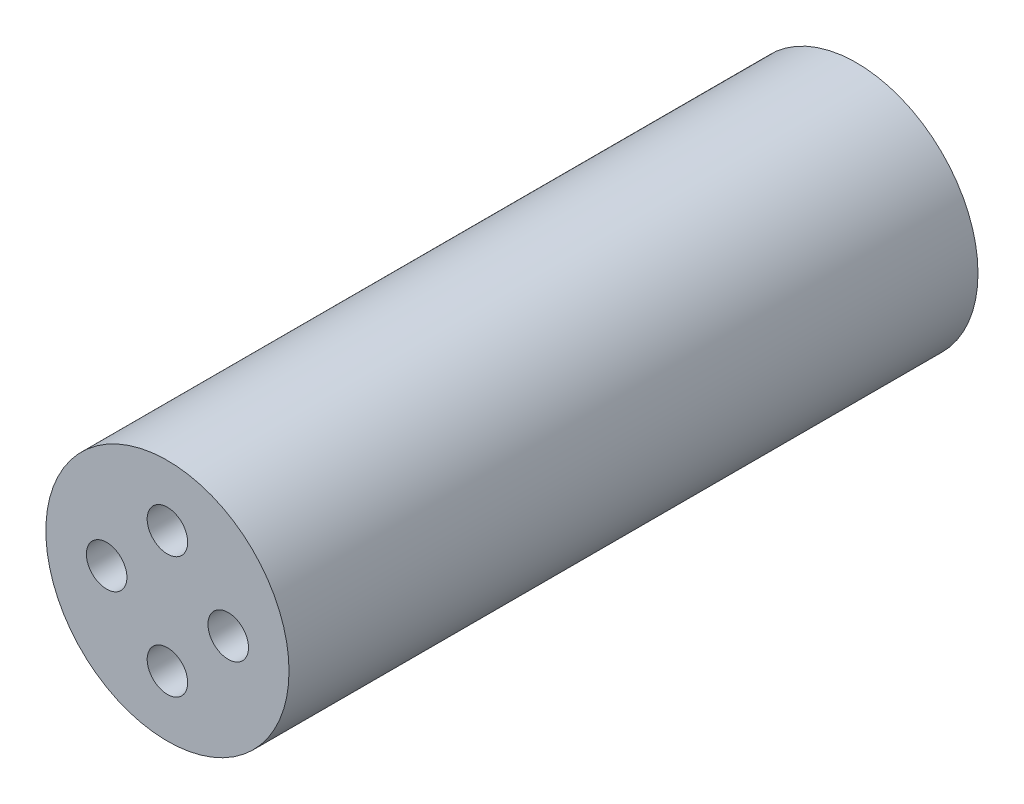
ISO-10303-21;
HEADER;
FILE_DESCRIPTION(('STEP AP214'),'2;1');
FILE_NAME('part.step','',(''),(''),'','','');
FILE_SCHEMA(('AUTOMOTIVE_DESIGN { 1 0 10303 214 1 1 1 1 }'));
ENDSEC;
DATA;
#1=APPLICATION_CONTEXT('core data for automotive mechanical design processes');
#2=APPLICATION_PROTOCOL_DEFINITION('international standard','automotive_design',2000,#1);
#3=PRODUCT_CONTEXT('',#1,'mechanical');
#4=PRODUCT('Part','Part','',(#3));
#5=PRODUCT_RELATED_PRODUCT_CATEGORY('part','',(#4));
#6=PRODUCT_DEFINITION_FORMATION('','',#4);
#7=PRODUCT_DEFINITION_CONTEXT('part definition',#1,'design');
#8=PRODUCT_DEFINITION('design','',#6,#7);
#9=PRODUCT_DEFINITION_SHAPE('','',#8);
#10=(LENGTH_UNIT() NAMED_UNIT(*) SI_UNIT(.MILLI.,.METRE.));
#11=(NAMED_UNIT(*) PLANE_ANGLE_UNIT() SI_UNIT($,.RADIAN.));
#12=(NAMED_UNIT(*) SI_UNIT($,.STERADIAN.) SOLID_ANGLE_UNIT());
#13=UNCERTAINTY_MEASURE_WITH_UNIT(LENGTH_MEASURE(1.E-05),#10,'distance_accuracy_value','');
#14=(GEOMETRIC_REPRESENTATION_CONTEXT(3) GLOBAL_UNCERTAINTY_ASSIGNED_CONTEXT((#13)) GLOBAL_UNIT_ASSIGNED_CONTEXT((#10,
#11,#12)) REPRESENTATION_CONTEXT('',''));
#15=CARTESIAN_POINT('',(0.,0.,0.));
#16=DIRECTION('',(0.,0.,1.));
#17=DIRECTION('',(1.,0.,0.));
#18=AXIS2_PLACEMENT_3D('',#15,#16,#17);
#19=CARTESIAN_POINT('',(0.,0.,85.));
#20=DIRECTION('',(0.,0.,-1.));
#21=DIRECTION('',(-1.,0.,0.));
#22=AXIS2_PLACEMENT_3D('',#19,#20,#21);
#23=CYLINDRICAL_SURFACE('',#22,15.);
#24=CARTESIAN_POINT('',(0.,0.,85.));
#25=DIRECTION('',(0.,0.,1.));
#26=DIRECTION('',(1.,0.,0.));
#27=AXIS2_PLACEMENT_3D('',#24,#25,#26);
#28=CIRCLE('',#27,15.);
#29=CARTESIAN_POINT('',(15.,0.,85.));
#30=VERTEX_POINT('',#29);
#31=EDGE_CURVE('E10',#30,#30,#28,.T.);
#32=ORIENTED_EDGE('',*,*,#31,.F.);
#33=EDGE_LOOP('',(#32));
#34=FACE_BOUND('',#33,.T.);
#35=CARTESIAN_POINT('',(0.,0.,0.));
#36=DIRECTION('',(0.,0.,1.));
#37=DIRECTION('',(1.,0.,0.));
#38=AXIS2_PLACEMENT_3D('',#35,#36,#37);
#39=CIRCLE('',#38,15.);
#40=CARTESIAN_POINT('',(15.,0.,0.));
#41=VERTEX_POINT('',#40);
#42=EDGE_CURVE('E33',#41,#41,#39,.T.);
#43=ORIENTED_EDGE('',*,*,#42,.T.);
#44=EDGE_LOOP('',(#43));
#45=FACE_BOUND('',#44,.T.);
#46=ADVANCED_FACE('F30',(#34,#45),#23,.T.);
#47=CARTESIAN_POINT('',(0.,0.,85.));
#48=DIRECTION('',(0.,0.,1.));
#49=DIRECTION('',(1.,0.,0.));
#50=AXIS2_PLACEMENT_3D('',#47,#48,#49);
#51=PLANE('',#50);
#52=CARTESIAN_POINT('',(0.,7.5,85.));
#53=DIRECTION('',(0.,0.,1.));
#54=DIRECTION('',(1.,0.,0.));
#55=AXIS2_PLACEMENT_3D('',#52,#53,#54);
#56=CIRCLE('',#55,2.5);
#57=CARTESIAN_POINT('',(2.5,7.5,85.));
#58=VERTEX_POINT('',#57);
#59=EDGE_CURVE('E60',#58,#58,#56,.T.);
#60=ORIENTED_EDGE('',*,*,#59,.F.);
#61=EDGE_LOOP('',(#60));
#62=FACE_BOUND('',#61,.T.);
#63=CARTESIAN_POINT('',(7.5,0.,85.));
#64=DIRECTION('',(0.,0.,1.));
#65=DIRECTION('',(1.,0.,0.));
#66=AXIS2_PLACEMENT_3D('',#63,#64,#65);
#67=CIRCLE('',#66,2.5);
#68=CARTESIAN_POINT('',(10.,0.,85.));
#69=VERTEX_POINT('',#68);
#70=EDGE_CURVE('E54',#69,#69,#67,.T.);
#71=ORIENTED_EDGE('',*,*,#70,.F.);
#72=EDGE_LOOP('',(#71));
#73=FACE_BOUND('',#72,.T.);
#74=CARTESIAN_POINT('',(4.24488671257339E-13,-7.5,85.));
#75=DIRECTION('',(0.,0.,1.));
#76=DIRECTION('',(1.,0.,0.));
#77=AXIS2_PLACEMENT_3D('',#74,#75,#76);
#78=CIRCLE('',#77,2.50000000000046);
#79=CARTESIAN_POINT('',(2.50000000000088,-7.5,85.));
#80=VERTEX_POINT('',#79);
#81=EDGE_CURVE('E48',#80,#80,#78,.T.);
#82=ORIENTED_EDGE('',*,*,#81,.F.);
#83=EDGE_LOOP('',(#82));
#84=FACE_BOUND('',#83,.T.);
#85=CARTESIAN_POINT('',(-7.49999999999979,-2.1316282072803E-13,85.));
#86=DIRECTION('',(0.,0.,1.));
#87=DIRECTION('',(1.,0.,0.));
#88=AXIS2_PLACEMENT_3D('',#85,#86,#87);
#89=CIRCLE('',#88,2.50000000000034);
#90=CARTESIAN_POINT('',(-4.99999999999945,-2.1316282072803E-13,85.));
#91=VERTEX_POINT('',#90);
#92=EDGE_CURVE('E42',#91,#91,#89,.T.);
#93=ORIENTED_EDGE('',*,*,#92,.F.);
#94=EDGE_LOOP('',(#93));
#95=FACE_BOUND('',#94,.T.);
#96=ORIENTED_EDGE('',*,*,#31,.T.);
#97=EDGE_LOOP('',(#96));
#98=FACE_BOUND('',#97,.T.);
#99=ADVANCED_FACE('F75',(#62,#73,#84,#95,#98),#51,.T.);
#100=CARTESIAN_POINT('',(0.,0.,0.));
#101=DIRECTION('',(0.,0.,1.));
#102=DIRECTION('',(1.,0.,0.));
#103=AXIS2_PLACEMENT_3D('',#100,#101,#102);
#104=PLANE('',#103);
#105=ORIENTED_EDGE('',*,*,#42,.F.);
#106=EDGE_LOOP('',(#105));
#107=FACE_BOUND('',#106,.T.);
#108=ADVANCED_FACE('F78',(#107),#104,.F.);
#109=CARTESIAN_POINT('',(-7.49999999999979,-2.1316282072803E-13,65.));
#110=DIRECTION('',(0.,0.,1.));
#111=DIRECTION('',(1.,0.,0.));
#112=AXIS2_PLACEMENT_3D('',#109,#110,#111);
#113=CYLINDRICAL_SURFACE('',#112,2.50000000000034);
#114=CARTESIAN_POINT('',(-7.49999999999979,-2.1316282072803E-13,65.));
#115=DIRECTION('',(0.,0.,1.));
#116=DIRECTION('',(1.,0.,0.));
#117=AXIS2_PLACEMENT_3D('',#114,#115,#116);
#118=CIRCLE('',#117,2.50000000000034);
#119=CARTESIAN_POINT('',(-4.99999999999945,-2.1316282072803E-13,65.));
#120=VERTEX_POINT('',#119);
#121=EDGE_CURVE('E45',#120,#120,#118,.T.);
#122=ORIENTED_EDGE('',*,*,#121,.F.);
#123=EDGE_LOOP('',(#122));
#124=FACE_BOUND('',#123,.T.);
#125=ORIENTED_EDGE('',*,*,#92,.T.);
#126=EDGE_LOOP('',(#125));
#127=FACE_BOUND('',#126,.T.);
#128=ADVANCED_FACE('F86',(#124,#127),#113,.F.);
#129=CARTESIAN_POINT('',(-7.49999999999979,-2.1316282072803E-13,65.));
#130=DIRECTION('',(0.,0.,1.));
#131=DIRECTION('',(1.,0.,0.));
#132=AXIS2_PLACEMENT_3D('',#129,#130,#131);
#133=PLANE('',#132);
#134=ORIENTED_EDGE('',*,*,#121,.T.);
#135=EDGE_LOOP('',(#134));
#136=FACE_BOUND('',#135,.T.);
#137=ADVANCED_FACE('F88',(#136),#133,.T.);
#138=CARTESIAN_POINT('',(4.24488671257339E-13,-7.5,65.));
#139=DIRECTION('',(0.,0.,1.));
#140=DIRECTION('',(1.,0.,0.));
#141=AXIS2_PLACEMENT_3D('',#138,#139,#140);
#142=CYLINDRICAL_SURFACE('',#141,2.50000000000046);
#143=CARTESIAN_POINT('',(4.24488671257339E-13,-7.5,65.));
#144=DIRECTION('',(0.,0.,1.));
#145=DIRECTION('',(1.,0.,0.));
#146=AXIS2_PLACEMENT_3D('',#143,#144,#145);
#147=CIRCLE('',#146,2.50000000000046);
#148=CARTESIAN_POINT('',(2.50000000000088,-7.5,65.));
#149=VERTEX_POINT('',#148);
#150=EDGE_CURVE('E51',#149,#149,#147,.T.);
#151=ORIENTED_EDGE('',*,*,#150,.F.);
#152=EDGE_LOOP('',(#151));
#153=FACE_BOUND('',#152,.T.);
#154=ORIENTED_EDGE('',*,*,#81,.T.);
#155=EDGE_LOOP('',(#154));
#156=FACE_BOUND('',#155,.T.);
#157=ADVANCED_FACE('F95',(#153,#156),#142,.F.);
#158=CARTESIAN_POINT('',(4.24488671257339E-13,-7.5,65.));
#159=DIRECTION('',(0.,0.,1.));
#160=DIRECTION('',(1.,0.,0.));
#161=AXIS2_PLACEMENT_3D('',#158,#159,#160);
#162=PLANE('',#161);
#163=ORIENTED_EDGE('',*,*,#150,.T.);
#164=EDGE_LOOP('',(#163));
#165=FACE_BOUND('',#164,.T.);
#166=ADVANCED_FACE('F135',(#165),#162,.T.);
#167=CARTESIAN_POINT('',(7.5,0.,65.));
#168=DIRECTION('',(0.,0.,1.));
#169=DIRECTION('',(1.,0.,0.));
#170=AXIS2_PLACEMENT_3D('',#167,#168,#169);
#171=CYLINDRICAL_SURFACE('',#170,2.5);
#172=CARTESIAN_POINT('',(7.5,0.,65.));
#173=DIRECTION('',(0.,0.,1.));
#174=DIRECTION('',(1.,0.,0.));
#175=AXIS2_PLACEMENT_3D('',#172,#173,#174);
#176=CIRCLE('',#175,2.5);
#177=CARTESIAN_POINT('',(10.,0.,65.));
#178=VERTEX_POINT('',#177);
#179=EDGE_CURVE('E57',#178,#178,#176,.T.);
#180=ORIENTED_EDGE('',*,*,#179,.F.);
#181=EDGE_LOOP('',(#180));
#182=FACE_BOUND('',#181,.T.);
#183=ORIENTED_EDGE('',*,*,#70,.T.);
#184=EDGE_LOOP('',(#183));
#185=FACE_BOUND('',#184,.T.);
#186=ADVANCED_FACE('F144',(#182,#185),#171,.F.);
#187=CARTESIAN_POINT('',(7.5,0.,65.));
#188=DIRECTION('',(0.,0.,1.));
#189=DIRECTION('',(1.,0.,0.));
#190=AXIS2_PLACEMENT_3D('',#187,#188,#189);
#191=PLANE('',#190);
#192=ORIENTED_EDGE('',*,*,#179,.T.);
#193=EDGE_LOOP('',(#192));
#194=FACE_BOUND('',#193,.T.);
#195=ADVANCED_FACE('F71',(#194),#191,.T.);
#196=CARTESIAN_POINT('',(0.,7.5,65.));
#197=DIRECTION('',(0.,0.,1.));
#198=DIRECTION('',(1.,0.,0.));
#199=AXIS2_PLACEMENT_3D('',#196,#197,#198);
#200=CYLINDRICAL_SURFACE('',#199,2.5);
#201=CARTESIAN_POINT('',(0.,7.5,65.));
#202=DIRECTION('',(0.,0.,1.));
#203=DIRECTION('',(1.,0.,0.));
#204=AXIS2_PLACEMENT_3D('',#201,#202,#203);
#205=CIRCLE('',#204,2.5);
#206=CARTESIAN_POINT('',(2.5,7.5,65.));
#207=VERTEX_POINT('',#206);
#208=EDGE_CURVE('E40',#207,#207,#205,.T.);
#209=ORIENTED_EDGE('',*,*,#208,.F.);
#210=EDGE_LOOP('',(#209));
#211=FACE_BOUND('',#210,.T.);
#212=ORIENTED_EDGE('',*,*,#59,.T.);
#213=EDGE_LOOP('',(#212));
#214=FACE_BOUND('',#213,.T.);
#215=ADVANCED_FACE('F68',(#211,#214),#200,.F.);
#216=CARTESIAN_POINT('',(0.,7.5,65.));
#217=DIRECTION('',(0.,0.,1.));
#218=DIRECTION('',(1.,0.,0.));
#219=AXIS2_PLACEMENT_3D('',#216,#217,#218);
#220=PLANE('',#219);
#221=ORIENTED_EDGE('',*,*,#208,.T.);
#222=EDGE_LOOP('',(#221));
#223=FACE_BOUND('',#222,.T.);
#224=ADVANCED_FACE('F66',(#223),#220,.T.);
#225=CLOSED_SHELL('',(#46,#99,#108,#128,#137,#157,#166,#186,#195,#215,#224));
#226=MANIFOLD_SOLID_BREP('B2',#225);
#227=ADVANCED_BREP_SHAPE_REPRESENTATION('',(#18,#226),#14);
#228=SHAPE_DEFINITION_REPRESENTATION(#9,#227);
ENDSEC;
END-ISO-10303-21;
